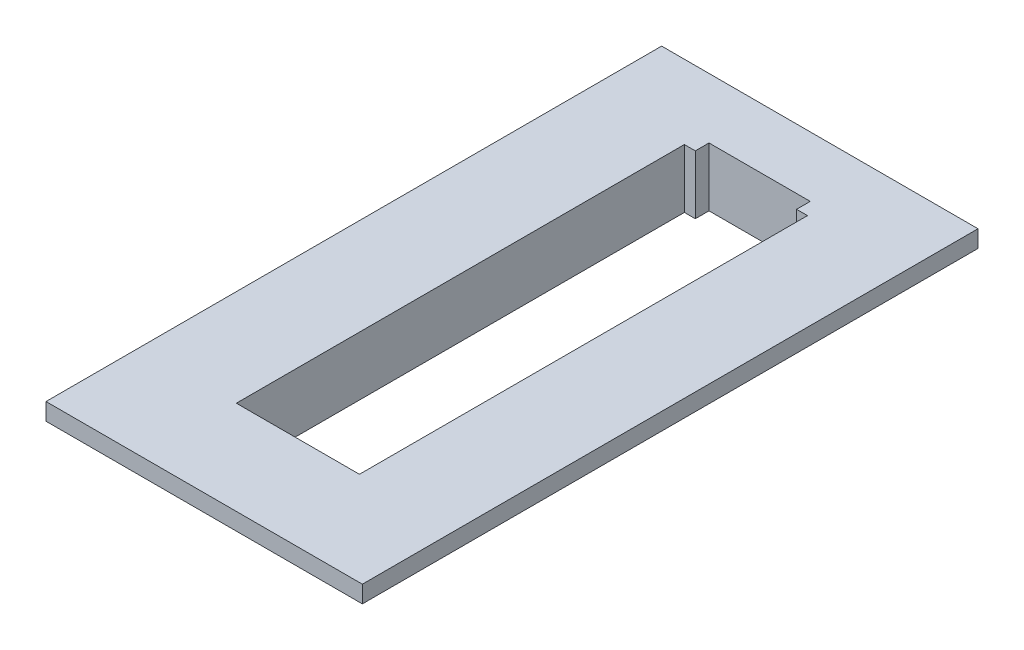
ISO-10303-21;
HEADER;
FILE_DESCRIPTION(('STEP AP214'),'2;1');
FILE_NAME('part.step','',(''),(''),'','','');
FILE_SCHEMA(('AUTOMOTIVE_DESIGN { 1 0 10303 214 1 1 1 1 }'));
ENDSEC;
DATA;
#1=APPLICATION_CONTEXT('core data for automotive mechanical design processes');
#2=APPLICATION_PROTOCOL_DEFINITION('international standard','automotive_design',2000,#1);
#3=PRODUCT_CONTEXT('',#1,'mechanical');
#4=PRODUCT('Part','Part','',(#3));
#5=PRODUCT_RELATED_PRODUCT_CATEGORY('part','',(#4));
#6=PRODUCT_DEFINITION_FORMATION('','',#4);
#7=PRODUCT_DEFINITION_CONTEXT('part definition',#1,'design');
#8=PRODUCT_DEFINITION('design','',#6,#7);
#9=PRODUCT_DEFINITION_SHAPE('','',#8);
#10=(LENGTH_UNIT() NAMED_UNIT(*) SI_UNIT(.MILLI.,.METRE.));
#11=(NAMED_UNIT(*) PLANE_ANGLE_UNIT() SI_UNIT($,.RADIAN.));
#12=(NAMED_UNIT(*) SI_UNIT($,.STERADIAN.) SOLID_ANGLE_UNIT());
#13=UNCERTAINTY_MEASURE_WITH_UNIT(LENGTH_MEASURE(1.E-05),#10,'distance_accuracy_value','');
#14=(GEOMETRIC_REPRESENTATION_CONTEXT(3) GLOBAL_UNCERTAINTY_ASSIGNED_CONTEXT((#13)) GLOBAL_UNIT_ASSIGNED_CONTEXT((#10,
#11,#12)) REPRESENTATION_CONTEXT('',''));
#15=CARTESIAN_POINT('',(0.,0.,0.));
#16=DIRECTION('',(0.,0.,1.));
#17=DIRECTION('',(1.,0.,0.));
#18=AXIS2_PLACEMENT_3D('',#15,#16,#17);
#19=CARTESIAN_POINT('',(-8.88178419700125E-12,149.999999999999,3129.99999999996));
#20=DIRECTION('',(0.,1.,0.));
#21=DIRECTION('',(0.,0.,-1.));
#22=AXIS2_PLACEMENT_3D('',#19,#20,#21);
#23=PLANE('',#22);
#24=DIRECTION('',(0.,0.,-1.));
#25=VECTOR('',#24,1.);
#26=CARTESIAN_POINT('',(1049.99999999998,149.999999999999,3280.));
#27=LINE('',#26,#25);
#28=CARTESIAN_POINT('',(1049.99999999998,149.999999999999,3280.));
#29=VERTEX_POINT('',#28);
#30=CARTESIAN_POINT('',(1049.99999999997,149.999999999999,-3770.00000000002));
#31=VERTEX_POINT('',#30);
#32=EDGE_CURVE('E183',#29,#31,#27,.T.);
#33=ORIENTED_EDGE('',*,*,#32,.F.);
#34=DIRECTION('',(1.,0.,0.));
#35=VECTOR('',#34,1.);
#36=CARTESIAN_POINT('',(1049.99999999998,149.999999999999,3280.));
#37=LINE('',#36,#35);
#38=CARTESIAN_POINT('',(-1049.99999999999,149.999999999999,3280.));
#39=VERTEX_POINT('',#38);
#40=EDGE_CURVE('E225',#39,#29,#37,.T.);
#41=ORIENTED_EDGE('',*,*,#40,.F.);
#42=DIRECTION('',(0.,0.,1.));
#43=VECTOR('',#42,1.);
#44=CARTESIAN_POINT('',(-1049.99999999999,149.999999999999,3280.));
#45=LINE('',#44,#43);
#46=CARTESIAN_POINT('',(-1049.99999999999,149.999999999999,-3770.00000000002));
#47=VERTEX_POINT('',#46);
#48=EDGE_CURVE('E245',#47,#39,#45,.T.);
#49=ORIENTED_EDGE('',*,*,#48,.F.);
#50=DIRECTION('',(-1.,0.,0.));
#51=VECTOR('',#50,1.);
#52=CARTESIAN_POINT('',(1049.99999999997,149.999999999999,-3770.00000000002));
#53=LINE('',#52,#51);
#54=EDGE_CURVE('E241',#31,#47,#53,.T.);
#55=ORIENTED_EDGE('',*,*,#54,.F.);
#56=EDGE_LOOP('',(#33,#41,#49,#55));
#57=FACE_BOUND('',#56,.T.);
#58=DIRECTION('',(0.,0.,1.));
#59=VECTOR('',#58,1.);
#60=CARTESIAN_POINT('',(899.999999999976,149.999999999999,3130.0000000001));
#61=LINE('',#60,#59);
#62=CARTESIAN_POINT('',(899.999999999975,149.999999999999,-3420.00000000004));
#63=VERTEX_POINT('',#62);
#64=CARTESIAN_POINT('',(899.999999999976,149.999999999999,3130.0000000001));
#65=VERTEX_POINT('',#64);
#66=EDGE_CURVE('E184',#63,#65,#61,.T.);
#67=ORIENTED_EDGE('',*,*,#66,.F.);
#68=DIRECTION('',(1.,0.,0.));
#69=VECTOR('',#68,1.);
#70=CARTESIAN_POINT('',(899.999999999975,149.999999999999,-3420.00000000004));
#71=LINE('',#70,#69);
#72=CARTESIAN_POINT('',(739.999999999991,149.999999999999,-3420.00000000002));
#73=VERTEX_POINT('',#72);
#74=EDGE_CURVE('E178',#73,#63,#71,.T.);
#75=ORIENTED_EDGE('',*,*,#74,.F.);
#76=DIRECTION('',(0.,0.,1.));
#77=VECTOR('',#76,1.);
#78=CARTESIAN_POINT('',(739.999999999991,149.999999999999,-3420.00000000002));
#79=LINE('',#78,#77);
#80=CARTESIAN_POINT('',(739.999999999991,149.999999999999,-3620.00000000002));
#81=VERTEX_POINT('',#80);
#82=EDGE_CURVE('E203',#81,#73,#79,.T.);
#83=ORIENTED_EDGE('',*,*,#82,.F.);
#84=DIRECTION('',(1.,0.,0.));
#85=VECTOR('',#84,1.);
#86=CARTESIAN_POINT('',(739.999999999991,149.999999999999,-3620.00000000002));
#87=LINE('',#86,#85);
#88=CARTESIAN_POINT('',(-740.000000000009,149.999999999999,-3620.00000000002));
#89=VERTEX_POINT('',#88);
#90=EDGE_CURVE('E370',#89,#81,#87,.T.);
#91=ORIENTED_EDGE('',*,*,#90,.F.);
#92=DIRECTION('',(0.,0.,-1.));
#93=VECTOR('',#92,1.);
#94=CARTESIAN_POINT('',(-740.000000000009,149.999999999999,-3620.00000000002));
#95=LINE('',#94,#93);
#96=CARTESIAN_POINT('',(-740.000000000009,149.999999999999,-3420.00000000002));
#97=VERTEX_POINT('',#96);
#98=EDGE_CURVE('E372',#97,#89,#95,.T.);
#99=ORIENTED_EDGE('',*,*,#98,.F.);
#100=DIRECTION('',(1.,0.,0.));
#101=VECTOR('',#100,1.);
#102=CARTESIAN_POINT('',(-740.000000000009,149.999999999999,-3420.00000000002));
#103=LINE('',#102,#101);
#104=CARTESIAN_POINT('',(-899.999999999779,149.999999999999,-3420.00000000004));
#105=VERTEX_POINT('',#104);
#106=EDGE_CURVE('E376',#105,#97,#103,.T.);
#107=ORIENTED_EDGE('',*,*,#106,.F.);
#108=DIRECTION('',(0.,0.,-1.));
#109=VECTOR('',#108,1.);
#110=CARTESIAN_POINT('',(-899.999999999773,149.999999999999,3130.0000000001));
#111=LINE('',#110,#109);
#112=CARTESIAN_POINT('',(-899.999999999773,149.999999999999,3130.0000000001));
#113=VERTEX_POINT('',#112);
#114=EDGE_CURVE('E197',#113,#105,#111,.T.);
#115=ORIENTED_EDGE('',*,*,#114,.F.);
#116=DIRECTION('',(-1.,0.,0.));
#117=VECTOR('',#116,1.);
#118=CARTESIAN_POINT('',(899.999999999976,149.999999999999,3130.0000000001));
#119=LINE('',#118,#117);
#120=EDGE_CURVE('E195',#65,#113,#119,.T.);
#121=ORIENTED_EDGE('',*,*,#120,.F.);
#122=EDGE_LOOP('',(#67,#75,#83,#91,#99,#107,#115,#121));
#123=FACE_BOUND('',#122,.T.);
#124=ADVANCED_FACE('F39',(#57,#123),#23,.F.);
#125=CARTESIAN_POINT('',(-2312.49999999999,11128.8252776693,-4500.));
#126=DIRECTION('',(1.,0.,0.));
#127=DIRECTION('',(0.,0.,-1.));
#128=AXIS2_PLACEMENT_3D('',#125,#126,#127);
#129=PLANE('',#128);
#130=DIRECTION('',(0.,0.,-1.));
#131=VECTOR('',#130,1.);
#132=CARTESIAN_POINT('',(-2312.49999999999,760.,-4500.));
#133=LINE('',#132,#131);
#134=CARTESIAN_POINT('',(-2312.49999999999,760.,4500.));
#135=VERTEX_POINT('',#134);
#136=CARTESIAN_POINT('',(-2312.49999999999,760.,-4500.));
#137=VERTEX_POINT('',#136);
#138=EDGE_CURVE('E317',#135,#137,#133,.T.);
#139=ORIENTED_EDGE('',*,*,#138,.F.);
#140=DIRECTION('',(0.,-1.,0.));
#141=VECTOR('',#140,1.);
#142=CARTESIAN_POINT('',(-2312.49999999999,11128.8252776693,4500.));
#143=LINE('',#142,#141);
#144=CARTESIAN_POINT('',(-2312.49999999999,1010.,4500.));
#145=VERTEX_POINT('',#144);
#146=EDGE_CURVE('E334',#145,#135,#143,.T.);
#147=ORIENTED_EDGE('',*,*,#146,.F.);
#148=DIRECTION('',(0.,0.,1.));
#149=VECTOR('',#148,1.);
#150=CARTESIAN_POINT('',(-2312.49999999999,1010.,-4500.));
#151=LINE('',#150,#149);
#152=CARTESIAN_POINT('',(-2312.49999999999,1010.,-4500.));
#153=VERTEX_POINT('',#152);
#154=EDGE_CURVE('E327',#153,#145,#151,.T.);
#155=ORIENTED_EDGE('',*,*,#154,.F.);
#156=DIRECTION('',(0.,-1.,0.));
#157=VECTOR('',#156,1.);
#158=CARTESIAN_POINT('',(-2312.49999999999,11128.8252776693,-4500.));
#159=LINE('',#158,#157);
#160=EDGE_CURVE('E319',#153,#137,#159,.T.);
#161=ORIENTED_EDGE('',*,*,#160,.T.);
#162=EDGE_LOOP('',(#139,#147,#155,#161));
#163=FACE_BOUND('',#162,.T.);
#164=ADVANCED_FACE('F401',(#163),#129,.F.);
#165=CARTESIAN_POINT('',(-2312.49999999999,11128.8252776693,4500.));
#166=DIRECTION('',(0.,0.,-1.));
#167=DIRECTION('',(-1.,0.,0.));
#168=AXIS2_PLACEMENT_3D('',#165,#166,#167);
#169=PLANE('',#168);
#170=DIRECTION('',(-1.,0.,0.));
#171=VECTOR('',#170,1.);
#172=CARTESIAN_POINT('',(-2312.49999999999,760.,4500.));
#173=LINE('',#172,#171);
#174=CARTESIAN_POINT('',(2312.49999999999,760.,4500.));
#175=VERTEX_POINT('',#174);
#176=EDGE_CURVE('E315',#175,#135,#173,.T.);
#177=ORIENTED_EDGE('',*,*,#176,.F.);
#178=DIRECTION('',(0.,-1.,0.));
#179=VECTOR('',#178,1.);
#180=CARTESIAN_POINT('',(2312.49999999999,11128.8252776693,4500.));
#181=LINE('',#180,#179);
#182=CARTESIAN_POINT('',(2312.49999999999,1010.,4500.));
#183=VERTEX_POINT('',#182);
#184=EDGE_CURVE('E337',#183,#175,#181,.T.);
#185=ORIENTED_EDGE('',*,*,#184,.F.);
#186=DIRECTION('',(1.,0.,0.));
#187=VECTOR('',#186,1.);
#188=CARTESIAN_POINT('',(-2312.49999999999,1010.,4500.));
#189=LINE('',#188,#187);
#190=EDGE_CURVE('E324',#145,#183,#189,.T.);
#191=ORIENTED_EDGE('',*,*,#190,.F.);
#192=ORIENTED_EDGE('',*,*,#146,.T.);
#193=EDGE_LOOP('',(#177,#185,#191,#192));
#194=FACE_BOUND('',#193,.T.);
#195=ADVANCED_FACE('F407',(#194),#169,.F.);
#196=CARTESIAN_POINT('',(2312.49999999999,11128.8252776693,4500.));
#197=DIRECTION('',(-1.,0.,0.));
#198=DIRECTION('',(0.,0.,1.));
#199=AXIS2_PLACEMENT_3D('',#196,#197,#198);
#200=PLANE('',#199);
#201=DIRECTION('',(0.,0.,1.));
#202=VECTOR('',#201,1.);
#203=CARTESIAN_POINT('',(2312.49999999999,760.,4500.));
#204=LINE('',#203,#202);
#205=CARTESIAN_POINT('',(2312.49999999999,760.,-4500.));
#206=VERTEX_POINT('',#205);
#207=EDGE_CURVE('E313',#206,#175,#204,.T.);
#208=ORIENTED_EDGE('',*,*,#207,.F.);
#209=DIRECTION('',(0.,-1.,0.));
#210=VECTOR('',#209,1.);
#211=CARTESIAN_POINT('',(2312.49999999999,11128.8252776693,-4500.));
#212=LINE('',#211,#210);
#213=CARTESIAN_POINT('',(2312.49999999999,1010.,-4500.));
#214=VERTEX_POINT('',#213);
#215=EDGE_CURVE('E333',#214,#206,#212,.T.);
#216=ORIENTED_EDGE('',*,*,#215,.F.);
#217=DIRECTION('',(0.,0.,-1.));
#218=VECTOR('',#217,1.);
#219=CARTESIAN_POINT('',(2312.49999999999,1010.,4500.));
#220=LINE('',#219,#218);
#221=EDGE_CURVE('E320',#183,#214,#220,.T.);
#222=ORIENTED_EDGE('',*,*,#221,.F.);
#223=ORIENTED_EDGE('',*,*,#184,.T.);
#224=EDGE_LOOP('',(#208,#216,#222,#223));
#225=FACE_BOUND('',#224,.T.);
#226=ADVANCED_FACE('F456',(#225),#200,.F.);
#227=CARTESIAN_POINT('',(2312.49999999999,11128.8252776693,-4500.));
#228=DIRECTION('',(0.,0.,1.));
#229=DIRECTION('',(1.,0.,0.));
#230=AXIS2_PLACEMENT_3D('',#227,#228,#229);
#231=PLANE('',#230);
#232=DIRECTION('',(1.,0.,0.));
#233=VECTOR('',#232,1.);
#234=CARTESIAN_POINT('',(2312.49999999999,760.,-4500.));
#235=LINE('',#234,#233);
#236=CARTESIAN_POINT('',(-1959.99999999999,760.,-4500.));
#237=VERTEX_POINT('',#236);
#238=EDGE_CURVE('E345',#137,#237,#235,.T.);
#239=ORIENTED_EDGE('',*,*,#238,.F.);
#240=ORIENTED_EDGE('',*,*,#160,.F.);
#241=DIRECTION('',(-1.,0.,0.));
#242=VECTOR('',#241,1.);
#243=CARTESIAN_POINT('',(2312.49999999999,1010.,-4500.));
#244=LINE('',#243,#242);
#245=EDGE_CURVE('E330',#214,#153,#244,.T.);
#246=ORIENTED_EDGE('',*,*,#245,.F.);
#247=ORIENTED_EDGE('',*,*,#215,.T.);
#248=CARTESIAN_POINT('',(1959.99999999997,760.,-4500.));
#249=VERTEX_POINT('',#248);
#250=EDGE_CURVE('E323',#249,#206,#235,.T.);
#251=ORIENTED_EDGE('',*,*,#250,.F.);
#252=DIRECTION('',(0.707106781186546,0.707106781186549,0.));
#253=VECTOR('',#252,1.);
#254=CARTESIAN_POINT('',(7320.66263883465,6120.6626388347,-4500.));
#255=LINE('',#254,#253);
#256=CARTESIAN_POINT('',(1779.99999999995,579.999999999973,-4500.));
#257=VERTEX_POINT('',#256);
#258=EDGE_CURVE('E308',#257,#249,#255,.T.);
#259=ORIENTED_EDGE('',*,*,#258,.F.);
#260=DIRECTION('',(-1.,0.,0.));
#261=VECTOR('',#260,1.);
#262=CARTESIAN_POINT('',(2312.49999999999,579.999999999973,-4500.));
#263=LINE('',#262,#261);
#264=CARTESIAN_POINT('',(-1779.99999999996,579.999999999974,-4500.));
#265=VERTEX_POINT('',#264);
#266=EDGE_CURVE('E305',#257,#265,#263,.T.);
#267=ORIENTED_EDGE('',*,*,#266,.T.);
#268=DIRECTION('',(0.707106781186546,-0.707106781186549,0.));
#269=VECTOR('',#268,1.);
#270=CARTESIAN_POINT('',(-5008.16263883467,3808.1626388347,-4500.));
#271=LINE('',#270,#269);
#272=EDGE_CURVE('E310',#237,#265,#271,.T.);
#273=ORIENTED_EDGE('',*,*,#272,.F.);
#274=EDGE_LOOP('',(#239,#240,#246,#247,#251,#259,#267,#273));
#275=FACE_BOUND('',#274,.T.);
#276=ADVANCED_FACE('F453',(#275),#231,.F.);
#277=CARTESIAN_POINT('',(-7.54951656745106E-12,1010.,-1.77635683940025E-12));
#278=DIRECTION('',(0.,1.,0.));
#279=DIRECTION('',(0.,0.,1.));
#280=AXIS2_PLACEMENT_3D('',#277,#278,#279);
#281=PLANE('',#280);
#282=DIRECTION('',(0.,0.,-1.));
#283=VECTOR('',#282,1.);
#284=CARTESIAN_POINT('',(899.999999999976,1010.,-1.88314164940236E-12));
#285=LINE('',#284,#283);
#286=CARTESIAN_POINT('',(899.999999999976,1010.,3130.0000000001));
#287=VERTEX_POINT('',#286);
#288=CARTESIAN_POINT('',(899.999999999975,1010.,-3420.00000000004));
#289=VERTEX_POINT('',#288);
#290=EDGE_CURVE('E11',#287,#289,#285,.T.);
#291=ORIENTED_EDGE('',*,*,#290,.F.);
#292=DIRECTION('',(1.,0.,0.));
#293=VECTOR('',#292,1.);
#294=CARTESIAN_POINT('',(-7.54951656745106E-12,1010.,3130.0000000001));
#295=LINE('',#294,#293);
#296=CARTESIAN_POINT('',(-899.999999999773,1010.,3130.0000000001));
#297=VERTEX_POINT('',#296);
#298=EDGE_CURVE('E47',#297,#287,#295,.T.);
#299=ORIENTED_EDGE('',*,*,#298,.F.);
#300=DIRECTION('',(0.,0.,1.));
#301=VECTOR('',#300,1.);
#302=CARTESIAN_POINT('',(-899.999999999776,1010.,-8.6105846795381E-13));
#303=LINE('',#302,#301);
#304=CARTESIAN_POINT('',(-899.999999999779,1010.,-3420.00000000004));
#305=VERTEX_POINT('',#304);
#306=EDGE_CURVE('E356',#305,#297,#303,.T.);
#307=ORIENTED_EDGE('',*,*,#306,.F.);
#308=DIRECTION('',(-1.,0.,0.));
#309=VECTOR('',#308,1.);
#310=CARTESIAN_POINT('',(3.1519231669154E-10,1010.,-3419.99999999995));
#311=LINE('',#310,#309);
#312=CARTESIAN_POINT('',(-740.000000000009,1010.,-3420.00000000002));
#313=VERTEX_POINT('',#312);
#314=EDGE_CURVE('E354',#313,#305,#311,.T.);
#315=ORIENTED_EDGE('',*,*,#314,.F.);
#316=DIRECTION('',(0.,0.,1.));
#317=VECTOR('',#316,1.);
#318=CARTESIAN_POINT('',(-740.000000000009,1010.,-1.77635683940025E-12));
#319=LINE('',#318,#317);
#320=CARTESIAN_POINT('',(-740.000000000009,1010.,-3620.00000000002));
#321=VERTEX_POINT('',#320);
#322=EDGE_CURVE('E352',#321,#313,#319,.T.);
#323=ORIENTED_EDGE('',*,*,#322,.F.);
#324=DIRECTION('',(-1.,0.,0.));
#325=VECTOR('',#324,1.);
#326=CARTESIAN_POINT('',(-7.54951656745106E-12,1010.,-3620.00000000002));
#327=LINE('',#326,#325);
#328=CARTESIAN_POINT('',(739.999999999991,1010.,-3620.00000000002));
#329=VERTEX_POINT('',#328);
#330=EDGE_CURVE('E350',#329,#321,#327,.T.);
#331=ORIENTED_EDGE('',*,*,#330,.F.);
#332=DIRECTION('',(0.,0.,-1.));
#333=VECTOR('',#332,1.);
#334=CARTESIAN_POINT('',(739.999999999991,1010.,-1.77635683940025E-12));
#335=LINE('',#334,#333);
#336=CARTESIAN_POINT('',(739.999999999991,1010.,-3420.00000000002));
#337=VERTEX_POINT('',#336);
#338=EDGE_CURVE('E348',#337,#329,#335,.T.);
#339=ORIENTED_EDGE('',*,*,#338,.F.);
#340=DIRECTION('',(-1.,0.,0.));
#341=VECTOR('',#340,1.);
#342=CARTESIAN_POINT('',(-3.30291349826011E-10,1010.,-3419.99999999995));
#343=LINE('',#342,#341);
#344=EDGE_CURVE('E346',#289,#337,#343,.T.);
#345=ORIENTED_EDGE('',*,*,#344,.F.);
#346=EDGE_LOOP('',(#291,#299,#307,#315,#323,#331,#339,#345));
#347=FACE_BOUND('',#346,.T.);
#348=ORIENTED_EDGE('',*,*,#245,.T.);
#349=ORIENTED_EDGE('',*,*,#154,.T.);
#350=ORIENTED_EDGE('',*,*,#190,.T.);
#351=ORIENTED_EDGE('',*,*,#221,.T.);
#352=EDGE_LOOP('',(#348,#349,#350,#351));
#353=FACE_BOUND('',#352,.T.);
#354=ADVANCED_FACE('F41',(#347,#353),#281,.T.);
#355=CARTESIAN_POINT('',(-3312.49999999999,760.,18485.8011696608));
#356=DIRECTION('',(0.,-1.,0.));
#357=DIRECTION('',(0.,0.,-1.));
#358=AXIS2_PLACEMENT_3D('',#355,#356,#357);
#359=PLANE('',#358);
#360=ORIENTED_EDGE('',*,*,#238,.T.);
#361=DIRECTION('',(0.,0.,-1.));
#362=VECTOR('',#361,1.);
#363=CARTESIAN_POINT('',(-1959.99999999999,760.,18485.8011696608));
#364=LINE('',#363,#362);
#365=CARTESIAN_POINT('',(-1959.99999999999,760.,4190.));
#366=VERTEX_POINT('',#365);
#367=EDGE_CURVE('E286',#366,#237,#364,.T.);
#368=ORIENTED_EDGE('',*,*,#367,.F.);
#369=DIRECTION('',(-1.,0.,0.));
#370=VECTOR('',#369,1.);
#371=CARTESIAN_POINT('',(19062.9596417098,760.,4190.));
#372=LINE('',#371,#370);
#373=CARTESIAN_POINT('',(1959.99999999997,760.,4190.));
#374=VERTEX_POINT('',#373);
#375=EDGE_CURVE('E269',#374,#366,#372,.T.);
#376=ORIENTED_EDGE('',*,*,#375,.F.);
#377=DIRECTION('',(0.,0.,-1.));
#378=VECTOR('',#377,1.);
#379=CARTESIAN_POINT('',(1959.99999999997,760.,18485.8011696608));
#380=LINE('',#379,#378);
#381=EDGE_CURVE('E290',#374,#249,#380,.T.);
#382=ORIENTED_EDGE('',*,*,#381,.T.);
#383=ORIENTED_EDGE('',*,*,#250,.T.);
#384=ORIENTED_EDGE('',*,*,#207,.T.);
#385=ORIENTED_EDGE('',*,*,#176,.T.);
#386=ORIENTED_EDGE('',*,*,#138,.T.);
#387=EDGE_LOOP('',(#360,#368,#376,#382,#383,#384,#385,#386));
#388=FACE_BOUND('',#387,.T.);
#389=ADVANCED_FACE('F443',(#388),#359,.T.);
#390=CARTESIAN_POINT('',(-1959.99999999999,760.,18485.8011696608));
#391=DIRECTION('',(-0.707106781186549,-0.707106781186546,0.));
#392=DIRECTION('',(0.707106781186546,-0.707106781186549,0.));
#393=AXIS2_PLACEMENT_3D('',#390,#391,#392);
#394=PLANE('',#393);
#395=ORIENTED_EDGE('',*,*,#272,.T.);
#396=DIRECTION('',(-0.577350269189623,0.577350269189626,-0.577350269189628));
#397=VECTOR('',#396,1.);
#398=CARTESIAN_POINT('',(5761.9337232203,-6961.93372322032,3041.93372322033));
#399=LINE('',#398,#397);
#400=CARTESIAN_POINT('',(-1199.99999999999,8.88178419700125E-13,-3920.00000000002));
#401=VERTEX_POINT('',#400);
#402=EDGE_CURVE('E268',#401,#265,#399,.T.);
#403=ORIENTED_EDGE('',*,*,#402,.F.);
#404=DIRECTION('',(0.,0.,-1.));
#405=VECTOR('',#404,1.);
#406=CARTESIAN_POINT('',(-1199.99999999999,0.,18485.8011696608));
#407=LINE('',#406,#405);
#408=CARTESIAN_POINT('',(-1199.99999999999,0.,3430.));
#409=VERTEX_POINT('',#408);
#410=EDGE_CURVE('E282',#409,#401,#407,.T.);
#411=ORIENTED_EDGE('',*,*,#410,.F.);
#412=DIRECTION('',(0.577350269189625,-0.577350269189627,-0.577350269189625));
#413=VECTOR('',#412,1.);
#414=CARTESIAN_POINT('',(-6725.26705655359,5525.26705655362,8955.2670565536));
#415=LINE('',#414,#413);
#416=EDGE_CURVE('E278',#366,#409,#415,.T.);
#417=ORIENTED_EDGE('',*,*,#416,.F.);
#418=ORIENTED_EDGE('',*,*,#367,.T.);
#419=EDGE_LOOP('',(#395,#403,#411,#417,#418));
#420=FACE_BOUND('',#419,.T.);
#421=ADVANCED_FACE('F441',(#420),#394,.T.);
#422=CARTESIAN_POINT('',(1199.99999999998,0.,18485.8011696608));
#423=DIRECTION('',(0.707106781186549,-0.707106781186546,0.));
#424=DIRECTION('',(0.707106781186546,0.707106781186549,0.));
#425=AXIS2_PLACEMENT_3D('',#422,#423,#424);
#426=PLANE('',#425);
#427=ORIENTED_EDGE('',*,*,#258,.T.);
#428=ORIENTED_EDGE('',*,*,#381,.F.);
#429=DIRECTION('',(0.577350269189625,0.577350269189627,0.577350269189625));
#430=VECTOR('',#429,1.);
#431=CARTESIAN_POINT('',(6218.60038988691,5018.60038988695,8448.60038988693));
#432=LINE('',#431,#430);
#433=CARTESIAN_POINT('',(1199.99999999997,0.,3430.));
#434=VERTEX_POINT('',#433);
#435=EDGE_CURVE('E301',#434,#374,#432,.T.);
#436=ORIENTED_EDGE('',*,*,#435,.F.);
#437=DIRECTION('',(0.,0.,-1.));
#438=VECTOR('',#437,1.);
#439=CARTESIAN_POINT('',(1199.99999999998,0.,18485.8011696608));
#440=LINE('',#439,#438);
#441=CARTESIAN_POINT('',(1199.99999999998,0.,-3920.00000000002));
#442=VERTEX_POINT('',#441);
#443=EDGE_CURVE('E294',#434,#442,#440,.T.);
#444=ORIENTED_EDGE('',*,*,#443,.T.);
#445=DIRECTION('',(-0.577350269189623,-0.577350269189626,0.577350269189628));
#446=VECTOR('',#445,1.);
#447=CARTESIAN_POINT('',(-6268.60038988698,-7468.60038988698,3548.60038988699));
#448=LINE('',#447,#446);
#449=EDGE_CURVE('E298',#257,#442,#448,.T.);
#450=ORIENTED_EDGE('',*,*,#449,.F.);
#451=EDGE_LOOP('',(#427,#428,#436,#444,#450));
#452=FACE_BOUND('',#451,.T.);
#453=ADVANCED_FACE('F437',(#452),#426,.T.);
#454=CARTESIAN_POINT('',(19062.9596417098,760.,-4680.00000000002));
#455=DIRECTION('',(0.,0.707106781186549,0.707106781186546));
#456=DIRECTION('',(0.,-0.707106781186546,0.707106781186549));
#457=AXIS2_PLACEMENT_3D('',#454,#455,#456);
#458=PLANE('',#457);
#459=ORIENTED_EDGE('',*,*,#449,.T.);
#460=DIRECTION('',(-1.,0.,0.));
#461=VECTOR('',#460,1.);
#462=CARTESIAN_POINT('',(19062.9596417098,0.,-3920.00000000002));
#463=LINE('',#462,#461);
#464=EDGE_CURVE('E255',#442,#401,#463,.T.);
#465=ORIENTED_EDGE('',*,*,#464,.T.);
#466=ORIENTED_EDGE('',*,*,#402,.T.);
#467=ORIENTED_EDGE('',*,*,#266,.F.);
#468=EDGE_LOOP('',(#459,#465,#466,#467));
#469=FACE_BOUND('',#468,.T.);
#470=ADVANCED_FACE('F433',(#469),#458,.F.);
#471=CARTESIAN_POINT('',(19062.9596417098,0.,3430.));
#472=DIRECTION('',(0.,0.707106781186546,-0.707106781186549));
#473=DIRECTION('',(0.,0.707106781186549,0.707106781186546));
#474=AXIS2_PLACEMENT_3D('',#471,#472,#473);
#475=PLANE('',#474);
#476=ORIENTED_EDGE('',*,*,#416,.T.);
#477=DIRECTION('',(-1.,0.,0.));
#478=VECTOR('',#477,1.);
#479=CARTESIAN_POINT('',(19062.9596417098,0.,3430.));
#480=LINE('',#479,#478);
#481=EDGE_CURVE('E264',#434,#409,#480,.T.);
#482=ORIENTED_EDGE('',*,*,#481,.F.);
#483=ORIENTED_EDGE('',*,*,#435,.T.);
#484=ORIENTED_EDGE('',*,*,#375,.T.);
#485=EDGE_LOOP('',(#476,#482,#483,#484));
#486=FACE_BOUND('',#485,.T.);
#487=ADVANCED_FACE('F430',(#486),#475,.F.);
#488=CARTESIAN_POINT('',(0.,0.,0.));
#489=DIRECTION('',(0.,1.,0.));
#490=DIRECTION('',(0.,0.,1.));
#491=AXIS2_PLACEMENT_3D('',#488,#489,#490);
#492=PLANE('',#491);
#493=DIRECTION('',(1.,0.,0.));
#494=VECTOR('',#493,1.);
#495=CARTESIAN_POINT('',(1049.99999999998,-4.44089209850063E-13,3280.));
#496=LINE('',#495,#494);
#497=CARTESIAN_POINT('',(-1049.99999999999,-4.44089209850063E-13,3280.));
#498=VERTEX_POINT('',#497);
#499=CARTESIAN_POINT('',(1049.99999999998,-4.44089209850063E-13,3280.));
#500=VERTEX_POINT('',#499);
#501=EDGE_CURVE('E233',#498,#500,#496,.T.);
#502=ORIENTED_EDGE('',*,*,#501,.T.);
#503=DIRECTION('',(0.,0.,-1.));
#504=VECTOR('',#503,1.);
#505=CARTESIAN_POINT('',(1049.99999999998,-4.44089209850063E-13,3280.));
#506=LINE('',#505,#504);
#507=CARTESIAN_POINT('',(1049.99999999997,-4.44089209850063E-13,-3770.00000000002));
#508=VERTEX_POINT('',#507);
#509=EDGE_CURVE('E220',#500,#508,#506,.T.);
#510=ORIENTED_EDGE('',*,*,#509,.T.);
#511=DIRECTION('',(-1.,0.,0.));
#512=VECTOR('',#511,1.);
#513=CARTESIAN_POINT('',(1049.99999999997,-4.44089209850063E-13,-3770.00000000002));
#514=LINE('',#513,#512);
#515=CARTESIAN_POINT('',(-1049.99999999999,0.,-3770.00000000002));
#516=VERTEX_POINT('',#515);
#517=EDGE_CURVE('E224',#508,#516,#514,.T.);
#518=ORIENTED_EDGE('',*,*,#517,.T.);
#519=DIRECTION('',(0.,0.,1.));
#520=VECTOR('',#519,1.);
#521=CARTESIAN_POINT('',(-1049.99999999999,-4.44089209850063E-13,3280.));
#522=LINE('',#521,#520);
#523=EDGE_CURVE('E229',#516,#498,#522,.T.);
#524=ORIENTED_EDGE('',*,*,#523,.T.);
#525=EDGE_LOOP('',(#502,#510,#518,#524));
#526=FACE_BOUND('',#525,.T.);
#527=ORIENTED_EDGE('',*,*,#410,.T.);
#528=ORIENTED_EDGE('',*,*,#464,.F.);
#529=ORIENTED_EDGE('',*,*,#443,.F.);
#530=ORIENTED_EDGE('',*,*,#481,.T.);
#531=EDGE_LOOP('',(#527,#528,#529,#530));
#532=FACE_BOUND('',#531,.T.);
#533=ADVANCED_FACE('F428',(#526,#532),#492,.F.);
#534=CARTESIAN_POINT('',(1049.99999999998,-4.44089209850063E-13,3280.));
#535=DIRECTION('',(1.,0.,0.));
#536=DIRECTION('',(0.,0.,-1.));
#537=AXIS2_PLACEMENT_3D('',#534,#535,#536);
#538=PLANE('',#537);
#539=ORIENTED_EDGE('',*,*,#32,.T.);
#540=DIRECTION('',(0.,1.,0.));
#541=VECTOR('',#540,1.);
#542=CARTESIAN_POINT('',(1049.99999999997,-4.44089209850063E-13,-3770.00000000002));
#543=LINE('',#542,#541);
#544=EDGE_CURVE('E237',#508,#31,#543,.T.);
#545=ORIENTED_EDGE('',*,*,#544,.F.);
#546=ORIENTED_EDGE('',*,*,#509,.F.);
#547=DIRECTION('',(0.,1.,0.));
#548=VECTOR('',#547,1.);
#549=CARTESIAN_POINT('',(1049.99999999998,-4.44089209850063E-13,3280.));
#550=LINE('',#549,#548);
#551=EDGE_CURVE('E252',#500,#29,#550,.T.);
#552=ORIENTED_EDGE('',*,*,#551,.T.);
#553=EDGE_LOOP('',(#539,#545,#546,#552));
#554=FACE_BOUND('',#553,.T.);
#555=ADVANCED_FACE('F417',(#554),#538,.F.);
#556=CARTESIAN_POINT('',(1049.99999999998,-4.44089209850063E-13,3280.));
#557=DIRECTION('',(0.,0.,1.));
#558=DIRECTION('',(1.,0.,0.));
#559=AXIS2_PLACEMENT_3D('',#556,#557,#558);
#560=PLANE('',#559);
#561=ORIENTED_EDGE('',*,*,#40,.T.);
#562=ORIENTED_EDGE('',*,*,#551,.F.);
#563=ORIENTED_EDGE('',*,*,#501,.F.);
#564=DIRECTION('',(0.,1.,0.));
#565=VECTOR('',#564,1.);
#566=CARTESIAN_POINT('',(-1049.99999999999,-4.44089209850063E-13,3280.));
#567=LINE('',#566,#565);
#568=EDGE_CURVE('E256',#498,#39,#567,.T.);
#569=ORIENTED_EDGE('',*,*,#568,.T.);
#570=EDGE_LOOP('',(#561,#562,#563,#569));
#571=FACE_BOUND('',#570,.T.);
#572=ADVANCED_FACE('F413',(#571),#560,.F.);
#573=CARTESIAN_POINT('',(-1049.99999999999,-4.44089209850063E-13,3280.));
#574=DIRECTION('',(-1.,0.,0.));
#575=DIRECTION('',(0.,0.,1.));
#576=AXIS2_PLACEMENT_3D('',#573,#574,#575);
#577=PLANE('',#576);
#578=ORIENTED_EDGE('',*,*,#48,.T.);
#579=ORIENTED_EDGE('',*,*,#568,.F.);
#580=ORIENTED_EDGE('',*,*,#523,.F.);
#581=DIRECTION('',(0.,1.,0.));
#582=VECTOR('',#581,1.);
#583=CARTESIAN_POINT('',(-1049.99999999999,-4.44089209850063E-13,-3770.00000000002));
#584=LINE('',#583,#582);
#585=EDGE_CURVE('E259',#516,#47,#584,.T.);
#586=ORIENTED_EDGE('',*,*,#585,.T.);
#587=EDGE_LOOP('',(#578,#579,#580,#586));
#588=FACE_BOUND('',#587,.T.);
#589=ADVANCED_FACE('F416',(#588),#577,.F.);
#590=CARTESIAN_POINT('',(1049.99999999997,-4.44089209850063E-13,-3770.00000000002));
#591=DIRECTION('',(0.,0.,-1.));
#592=DIRECTION('',(-1.,0.,0.));
#593=AXIS2_PLACEMENT_3D('',#590,#591,#592);
#594=PLANE('',#593);
#595=ORIENTED_EDGE('',*,*,#54,.T.);
#596=ORIENTED_EDGE('',*,*,#585,.F.);
#597=ORIENTED_EDGE('',*,*,#517,.F.);
#598=ORIENTED_EDGE('',*,*,#544,.T.);
#599=EDGE_LOOP('',(#595,#596,#597,#598));
#600=FACE_BOUND('',#599,.T.);
#601=ADVANCED_FACE('F421',(#600),#594,.F.);
#602=CARTESIAN_POINT('',(899.999999999976,-6835.87861331706,3130.0000000001));
#603=DIRECTION('',(1.,0.,0.));
#604=DIRECTION('',(0.,0.,-1.));
#605=AXIS2_PLACEMENT_3D('',#602,#603,#604);
#606=PLANE('',#605);
#607=ORIENTED_EDGE('',*,*,#290,.T.);
#608=DIRECTION('',(0.,1.,0.));
#609=VECTOR('',#608,1.);
#610=CARTESIAN_POINT('',(899.999999999975,-6835.87861331706,-3420.00000000004));
#611=LINE('',#610,#609);
#612=EDGE_CURVE('E59',#63,#289,#611,.T.);
#613=ORIENTED_EDGE('',*,*,#612,.F.);
#614=ORIENTED_EDGE('',*,*,#66,.T.);
#615=DIRECTION('',(0.,1.,0.));
#616=VECTOR('',#615,1.);
#617=CARTESIAN_POINT('',(899.999999999976,-6835.87861331706,3130.0000000001));
#618=LINE('',#617,#616);
#619=EDGE_CURVE('E201',#65,#287,#618,.T.);
#620=ORIENTED_EDGE('',*,*,#619,.T.);
#621=EDGE_LOOP('',(#607,#613,#614,#620));
#622=FACE_BOUND('',#621,.T.);
#623=ADVANCED_FACE('F187',(#622),#606,.F.);
#624=CARTESIAN_POINT('',(899.999999999976,-6835.87861331706,3130.0000000001));
#625=DIRECTION('',(0.,0.,1.));
#626=DIRECTION('',(1.,0.,0.));
#627=AXIS2_PLACEMENT_3D('',#624,#625,#626);
#628=PLANE('',#627);
#629=ORIENTED_EDGE('',*,*,#298,.T.);
#630=ORIENTED_EDGE('',*,*,#619,.F.);
#631=ORIENTED_EDGE('',*,*,#120,.T.);
#632=DIRECTION('',(0.,1.,0.));
#633=VECTOR('',#632,1.);
#634=CARTESIAN_POINT('',(-899.999999999773,-6835.87861331706,3130.0000000001));
#635=LINE('',#634,#633);
#636=EDGE_CURVE('E204',#113,#297,#635,.T.);
#637=ORIENTED_EDGE('',*,*,#636,.T.);
#638=EDGE_LOOP('',(#629,#630,#631,#637));
#639=FACE_BOUND('',#638,.T.);
#640=ADVANCED_FACE('F359',(#639),#628,.F.);
#641=CARTESIAN_POINT('',(-899.999999999773,-6835.87861331706,3130.0000000001));
#642=DIRECTION('',(-1.,0.,0.));
#643=DIRECTION('',(0.,0.,1.));
#644=AXIS2_PLACEMENT_3D('',#641,#642,#643);
#645=PLANE('',#644);
#646=ORIENTED_EDGE('',*,*,#306,.T.);
#647=ORIENTED_EDGE('',*,*,#636,.F.);
#648=ORIENTED_EDGE('',*,*,#114,.T.);
#649=DIRECTION('',(0.,1.,0.));
#650=VECTOR('',#649,1.);
#651=CARTESIAN_POINT('',(-899.999999999779,-6835.87861331706,-3420.00000000004));
#652=LINE('',#651,#650);
#653=EDGE_CURVE('E207',#105,#305,#652,.T.);
#654=ORIENTED_EDGE('',*,*,#653,.T.);
#655=EDGE_LOOP('',(#646,#647,#648,#654));
#656=FACE_BOUND('',#655,.T.);
#657=ADVANCED_FACE('F379',(#656),#645,.F.);
#658=CARTESIAN_POINT('',(-740.000000000009,-6835.87861331706,-3420.00000000002));
#659=DIRECTION('',(0.,0.,-1.));
#660=DIRECTION('',(-1.,0.,0.));
#661=AXIS2_PLACEMENT_3D('',#658,#659,#660);
#662=PLANE('',#661);
#663=ORIENTED_EDGE('',*,*,#314,.T.);
#664=ORIENTED_EDGE('',*,*,#653,.F.);
#665=ORIENTED_EDGE('',*,*,#106,.T.);
#666=DIRECTION('',(0.,1.,0.));
#667=VECTOR('',#666,1.);
#668=CARTESIAN_POINT('',(-740.000000000009,-6835.87861331706,-3420.00000000002));
#669=LINE('',#668,#667);
#670=EDGE_CURVE('E210',#97,#313,#669,.T.);
#671=ORIENTED_EDGE('',*,*,#670,.T.);
#672=EDGE_LOOP('',(#663,#664,#665,#671));
#673=FACE_BOUND('',#672,.T.);
#674=ADVANCED_FACE('F382',(#673),#662,.F.);
#675=CARTESIAN_POINT('',(-740.000000000009,-6835.87861331706,-3620.00000000002));
#676=DIRECTION('',(-1.,0.,0.));
#677=DIRECTION('',(0.,0.,1.));
#678=AXIS2_PLACEMENT_3D('',#675,#676,#677);
#679=PLANE('',#678);
#680=ORIENTED_EDGE('',*,*,#322,.T.);
#681=ORIENTED_EDGE('',*,*,#670,.F.);
#682=ORIENTED_EDGE('',*,*,#98,.T.);
#683=DIRECTION('',(0.,1.,0.));
#684=VECTOR('',#683,1.);
#685=CARTESIAN_POINT('',(-740.000000000009,-6835.87861331706,-3620.00000000002));
#686=LINE('',#685,#684);
#687=EDGE_CURVE('E213',#89,#321,#686,.T.);
#688=ORIENTED_EDGE('',*,*,#687,.T.);
#689=EDGE_LOOP('',(#680,#681,#682,#688));
#690=FACE_BOUND('',#689,.T.);
#691=ADVANCED_FACE('F388',(#690),#679,.F.);
#692=CARTESIAN_POINT('',(739.999999999991,-6835.87861331706,-3620.00000000002));
#693=DIRECTION('',(0.,0.,-1.));
#694=DIRECTION('',(-1.,0.,0.));
#695=AXIS2_PLACEMENT_3D('',#692,#693,#694);
#696=PLANE('',#695);
#697=ORIENTED_EDGE('',*,*,#330,.T.);
#698=ORIENTED_EDGE('',*,*,#687,.F.);
#699=ORIENTED_EDGE('',*,*,#90,.T.);
#700=DIRECTION('',(0.,1.,0.));
#701=VECTOR('',#700,1.);
#702=CARTESIAN_POINT('',(739.999999999991,-6835.87861331706,-3620.00000000002));
#703=LINE('',#702,#701);
#704=EDGE_CURVE('E216',#81,#329,#703,.T.);
#705=ORIENTED_EDGE('',*,*,#704,.T.);
#706=EDGE_LOOP('',(#697,#698,#699,#705));
#707=FACE_BOUND('',#706,.T.);
#708=ADVANCED_FACE('F391',(#707),#696,.F.);
#709=CARTESIAN_POINT('',(739.999999999991,-6835.87861331706,-3420.00000000002));
#710=DIRECTION('',(1.,0.,0.));
#711=DIRECTION('',(0.,0.,-1.));
#712=AXIS2_PLACEMENT_3D('',#709,#710,#711);
#713=PLANE('',#712);
#714=ORIENTED_EDGE('',*,*,#338,.T.);
#715=ORIENTED_EDGE('',*,*,#704,.F.);
#716=ORIENTED_EDGE('',*,*,#82,.T.);
#717=DIRECTION('',(0.,1.,0.));
#718=VECTOR('',#717,1.);
#719=CARTESIAN_POINT('',(739.999999999991,-6835.87861331706,-3420.00000000002));
#720=LINE('',#719,#718);
#721=EDGE_CURVE('E54',#73,#337,#720,.T.);
#722=ORIENTED_EDGE('',*,*,#721,.T.);
#723=EDGE_LOOP('',(#714,#715,#716,#722));
#724=FACE_BOUND('',#723,.T.);
#725=ADVANCED_FACE('F367',(#724),#713,.F.);
#726=CARTESIAN_POINT('',(899.999999999975,-6835.87861331706,-3420.00000000004));
#727=DIRECTION('',(0.,0.,-1.));
#728=DIRECTION('',(-1.,0.,0.));
#729=AXIS2_PLACEMENT_3D('',#726,#727,#728);
#730=PLANE('',#729);
#731=ORIENTED_EDGE('',*,*,#344,.T.);
#732=ORIENTED_EDGE('',*,*,#721,.F.);
#733=ORIENTED_EDGE('',*,*,#74,.T.);
#734=ORIENTED_EDGE('',*,*,#612,.T.);
#735=EDGE_LOOP('',(#731,#732,#733,#734));
#736=FACE_BOUND('',#735,.T.);
#737=ADVANCED_FACE('F179',(#736),#730,.F.);
#738=CLOSED_SHELL('',(#124,#164,#195,#226,#276,#354,#389,#421,#453,#470,#487,#533,#555,#572,
#589,#601,#623,#640,#657,#674,#691,#708,#725,#737));
#739=MANIFOLD_SOLID_BREP('B2',#738);
#740=ADVANCED_BREP_SHAPE_REPRESENTATION('',(#18,#739),#14);
#741=SHAPE_DEFINITION_REPRESENTATION(#9,#740);
ENDSEC;
END-ISO-10303-21;
